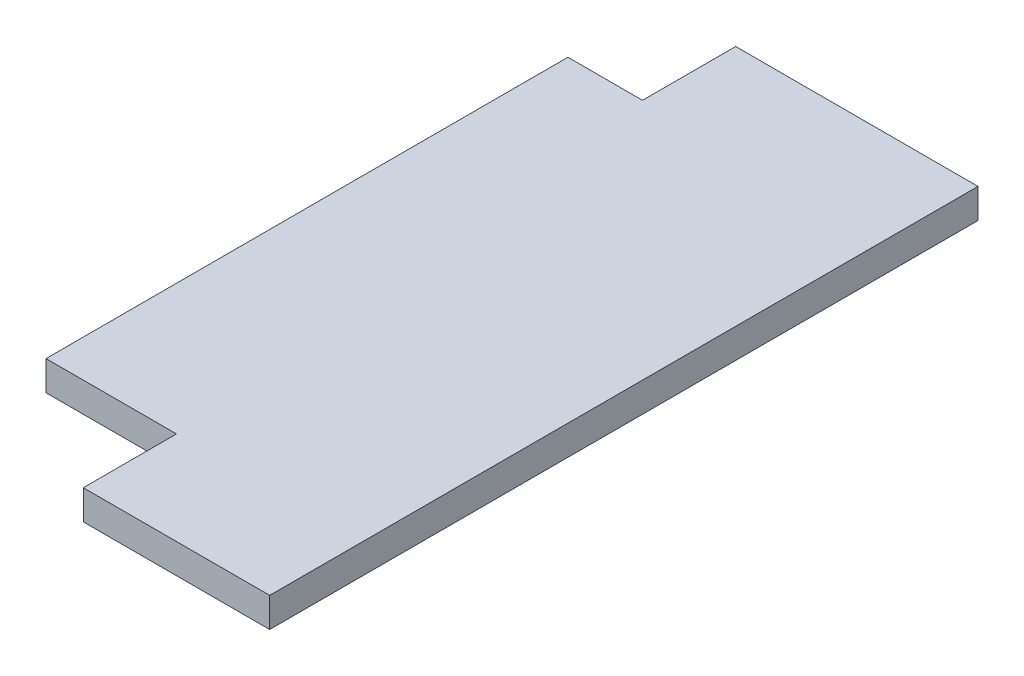
ISO-10303-21;
HEADER;
FILE_DESCRIPTION(('STEP AP214'),'2;1');
FILE_NAME('part.step','',(''),(''),'','','');
FILE_SCHEMA(('AUTOMOTIVE_DESIGN { 1 0 10303 214 1 1 1 1 }'));
ENDSEC;
DATA;
#1=APPLICATION_CONTEXT('core data for automotive mechanical design processes');
#2=APPLICATION_PROTOCOL_DEFINITION('international standard','automotive_design',2000,#1);
#3=PRODUCT_CONTEXT('',#1,'mechanical');
#4=PRODUCT('Part','Part','',(#3));
#5=PRODUCT_RELATED_PRODUCT_CATEGORY('part','',(#4));
#6=PRODUCT_DEFINITION_FORMATION('','',#4);
#7=PRODUCT_DEFINITION_CONTEXT('part definition',#1,'design');
#8=PRODUCT_DEFINITION('design','',#6,#7);
#9=PRODUCT_DEFINITION_SHAPE('','',#8);
#10=(LENGTH_UNIT() NAMED_UNIT(*) SI_UNIT(.MILLI.,.METRE.));
#11=(NAMED_UNIT(*) PLANE_ANGLE_UNIT() SI_UNIT($,.RADIAN.));
#12=(NAMED_UNIT(*) SI_UNIT($,.STERADIAN.) SOLID_ANGLE_UNIT());
#13=UNCERTAINTY_MEASURE_WITH_UNIT(LENGTH_MEASURE(1.E-05),#10,'distance_accuracy_value','');
#14=(GEOMETRIC_REPRESENTATION_CONTEXT(3) GLOBAL_UNCERTAINTY_ASSIGNED_CONTEXT((#13)) GLOBAL_UNIT_ASSIGNED_CONTEXT((#10,
#11,#12)) REPRESENTATION_CONTEXT('',''));
#15=CARTESIAN_POINT('',(0.,0.,0.));
#16=DIRECTION('',(0.,0.,1.));
#17=DIRECTION('',(1.,0.,0.));
#18=AXIS2_PLACEMENT_3D('',#15,#16,#17);
#19=CARTESIAN_POINT('',(-10.,1.5875,0.));
#20=DIRECTION('',(0.,0.,-1.));
#21=DIRECTION('',(-1.,0.,0.));
#22=AXIS2_PLACEMENT_3D('',#19,#20,#21);
#23=PLANE('',#22);
#24=DIRECTION('',(1.,0.,0.));
#25=VECTOR('',#24,1.);
#26=CARTESIAN_POINT('',(-10.,0.,0.));
#27=LINE('',#26,#25);
#28=CARTESIAN_POINT('',(-10.,0.,0.));
#29=VERTEX_POINT('',#28);
#30=CARTESIAN_POINT('',(0.,0.,0.));
#31=VERTEX_POINT('',#30);
#32=EDGE_CURVE('E129',#29,#31,#27,.T.);
#33=ORIENTED_EDGE('',*,*,#32,.T.);
#34=DIRECTION('',(0.,-1.,0.));
#35=VECTOR('',#34,1.);
#36=CARTESIAN_POINT('',(0.,1.5875,0.));
#37=LINE('',#36,#35);
#38=CARTESIAN_POINT('',(0.,1.5875,0.));
#39=VERTEX_POINT('',#38);
#40=EDGE_CURVE('E11',#39,#31,#37,.T.);
#41=ORIENTED_EDGE('',*,*,#40,.F.);
#42=DIRECTION('',(1.,0.,0.));
#43=VECTOR('',#42,1.);
#44=CARTESIAN_POINT('',(-10.,1.5875,0.));
#45=LINE('',#44,#43);
#46=CARTESIAN_POINT('',(-10.,1.5875,0.));
#47=VERTEX_POINT('',#46);
#48=EDGE_CURVE('E143',#47,#39,#45,.T.);
#49=ORIENTED_EDGE('',*,*,#48,.F.);
#50=DIRECTION('',(0.,-1.,0.));
#51=VECTOR('',#50,1.);
#52=CARTESIAN_POINT('',(-10.,1.5875,0.));
#53=LINE('',#52,#51);
#54=EDGE_CURVE('E125',#47,#29,#53,.T.);
#55=ORIENTED_EDGE('',*,*,#54,.T.);
#56=EDGE_LOOP('',(#33,#41,#49,#55));
#57=FACE_BOUND('',#56,.T.);
#58=ADVANCED_FACE('F33',(#57),#23,.F.);
#59=CARTESIAN_POINT('',(0.,1.5875,0.));
#60=DIRECTION('',(-1.,0.,0.));
#61=DIRECTION('',(0.,0.,1.));
#62=AXIS2_PLACEMENT_3D('',#59,#60,#61);
#63=PLANE('',#62);
#64=DIRECTION('',(0.,0.,-1.));
#65=VECTOR('',#64,1.);
#66=CARTESIAN_POINT('',(0.,0.,0.));
#67=LINE('',#66,#65);
#68=CARTESIAN_POINT('',(0.,0.,-38.));
#69=VERTEX_POINT('',#68);
#70=EDGE_CURVE('E132',#31,#69,#67,.T.);
#71=ORIENTED_EDGE('',*,*,#70,.T.);
#72=DIRECTION('',(0.,-1.,0.));
#73=VECTOR('',#72,1.);
#74=CARTESIAN_POINT('',(0.,1.5875,-38.));
#75=LINE('',#74,#73);
#76=CARTESIAN_POINT('',(0.,1.5875,-38.));
#77=VERTEX_POINT('',#76);
#78=EDGE_CURVE('E41',#77,#69,#75,.T.);
#79=ORIENTED_EDGE('',*,*,#78,.F.);
#80=DIRECTION('',(0.,0.,-1.));
#81=VECTOR('',#80,1.);
#82=CARTESIAN_POINT('',(0.,1.5875,0.));
#83=LINE('',#82,#81);
#84=EDGE_CURVE('E92',#39,#77,#83,.T.);
#85=ORIENTED_EDGE('',*,*,#84,.F.);
#86=ORIENTED_EDGE('',*,*,#40,.T.);
#87=EDGE_LOOP('',(#71,#79,#85,#86));
#88=FACE_BOUND('',#87,.T.);
#89=ADVANCED_FACE('F178',(#88),#63,.F.);
#90=CARTESIAN_POINT('',(0.,1.5875,-38.));
#91=DIRECTION('',(0.,0.,1.));
#92=DIRECTION('',(1.,0.,0.));
#93=AXIS2_PLACEMENT_3D('',#90,#91,#92);
#94=PLANE('',#93);
#95=DIRECTION('',(-1.,0.,0.));
#96=VECTOR('',#95,1.);
#97=CARTESIAN_POINT('',(0.,0.,-38.));
#98=LINE('',#97,#96);
#99=CARTESIAN_POINT('',(-13.,0.,-38.));
#100=VERTEX_POINT('',#99);
#101=EDGE_CURVE('E134',#69,#100,#98,.T.);
#102=ORIENTED_EDGE('',*,*,#101,.T.);
#103=DIRECTION('',(0.,-1.,0.));
#104=VECTOR('',#103,1.);
#105=CARTESIAN_POINT('',(-13.,1.5875,-38.));
#106=LINE('',#105,#104);
#107=CARTESIAN_POINT('',(-13.,1.5875,-38.));
#108=VERTEX_POINT('',#107);
#109=EDGE_CURVE('E150',#108,#100,#106,.T.);
#110=ORIENTED_EDGE('',*,*,#109,.F.);
#111=DIRECTION('',(-1.,0.,0.));
#112=VECTOR('',#111,1.);
#113=CARTESIAN_POINT('',(0.,1.5875,-38.));
#114=LINE('',#113,#112);
#115=EDGE_CURVE('E158',#77,#108,#114,.T.);
#116=ORIENTED_EDGE('',*,*,#115,.F.);
#117=ORIENTED_EDGE('',*,*,#78,.T.);
#118=EDGE_LOOP('',(#102,#110,#116,#117));
#119=FACE_BOUND('',#118,.T.);
#120=ADVANCED_FACE('F156',(#119),#94,.F.);
#121=CARTESIAN_POINT('',(-13.,1.5875,-38.));
#122=DIRECTION('',(1.,0.,0.));
#123=DIRECTION('',(0.,0.,-1.));
#124=AXIS2_PLACEMENT_3D('',#121,#122,#123);
#125=PLANE('',#124);
#126=DIRECTION('',(0.,0.,1.));
#127=VECTOR('',#126,1.);
#128=CARTESIAN_POINT('',(-13.,0.,-38.));
#129=LINE('',#128,#127);
#130=CARTESIAN_POINT('',(-13.,0.,-33.));
#131=VERTEX_POINT('',#130);
#132=EDGE_CURVE('E136',#100,#131,#129,.T.);
#133=ORIENTED_EDGE('',*,*,#132,.T.);
#134=DIRECTION('',(0.,-1.,0.));
#135=VECTOR('',#134,1.);
#136=CARTESIAN_POINT('',(-13.,1.5875,-33.));
#137=LINE('',#136,#135);
#138=CARTESIAN_POINT('',(-13.,1.5875,-33.));
#139=VERTEX_POINT('',#138);
#140=EDGE_CURVE('E147',#139,#131,#137,.T.);
#141=ORIENTED_EDGE('',*,*,#140,.F.);
#142=DIRECTION('',(0.,0.,1.));
#143=VECTOR('',#142,1.);
#144=CARTESIAN_POINT('',(-13.,1.5875,-38.));
#145=LINE('',#144,#143);
#146=EDGE_CURVE('E170',#108,#139,#145,.T.);
#147=ORIENTED_EDGE('',*,*,#146,.F.);
#148=ORIENTED_EDGE('',*,*,#109,.T.);
#149=EDGE_LOOP('',(#133,#141,#147,#148));
#150=FACE_BOUND('',#149,.T.);
#151=ADVANCED_FACE('F166',(#150),#125,.F.);
#152=CARTESIAN_POINT('',(-13.,1.5875,-33.));
#153=DIRECTION('',(0.,0.,1.));
#154=DIRECTION('',(1.,0.,0.));
#155=AXIS2_PLACEMENT_3D('',#152,#153,#154);
#156=PLANE('',#155);
#157=DIRECTION('',(-1.,0.,0.));
#158=VECTOR('',#157,1.);
#159=CARTESIAN_POINT('',(-13.,0.,-33.));
#160=LINE('',#159,#158);
#161=CARTESIAN_POINT('',(-17.,0.,-33.));
#162=VERTEX_POINT('',#161);
#163=EDGE_CURVE('E138',#131,#162,#160,.T.);
#164=ORIENTED_EDGE('',*,*,#163,.T.);
#165=DIRECTION('',(0.,-1.,0.));
#166=VECTOR('',#165,1.);
#167=CARTESIAN_POINT('',(-17.,1.5875,-33.));
#168=LINE('',#167,#166);
#169=CARTESIAN_POINT('',(-17.,1.5875,-33.));
#170=VERTEX_POINT('',#169);
#171=EDGE_CURVE('E120',#170,#162,#168,.T.);
#172=ORIENTED_EDGE('',*,*,#171,.F.);
#173=DIRECTION('',(-1.,0.,0.));
#174=VECTOR('',#173,1.);
#175=CARTESIAN_POINT('',(-13.,1.5875,-33.));
#176=LINE('',#175,#174);
#177=EDGE_CURVE('E111',#139,#170,#176,.T.);
#178=ORIENTED_EDGE('',*,*,#177,.F.);
#179=ORIENTED_EDGE('',*,*,#140,.T.);
#180=EDGE_LOOP('',(#164,#172,#178,#179));
#181=FACE_BOUND('',#180,.T.);
#182=ADVANCED_FACE('F169',(#181),#156,.F.);
#183=CARTESIAN_POINT('',(-17.,1.5875,-33.));
#184=DIRECTION('',(1.,0.,0.));
#185=DIRECTION('',(0.,0.,-1.));
#186=AXIS2_PLACEMENT_3D('',#183,#184,#185);
#187=PLANE('',#186);
#188=DIRECTION('',(0.,0.,1.));
#189=VECTOR('',#188,1.);
#190=CARTESIAN_POINT('',(-17.,0.,-33.));
#191=LINE('',#190,#189);
#192=CARTESIAN_POINT('',(-17.,0.,-5.));
#193=VERTEX_POINT('',#192);
#194=EDGE_CURVE('E119',#162,#193,#191,.T.);
#195=ORIENTED_EDGE('',*,*,#194,.T.);
#196=DIRECTION('',(0.,-1.,0.));
#197=VECTOR('',#196,1.);
#198=CARTESIAN_POINT('',(-17.,1.5875,-5.));
#199=LINE('',#198,#197);
#200=CARTESIAN_POINT('',(-17.,1.5875,-5.));
#201=VERTEX_POINT('',#200);
#202=EDGE_CURVE('E116',#201,#193,#199,.T.);
#203=ORIENTED_EDGE('',*,*,#202,.F.);
#204=DIRECTION('',(0.,0.,1.));
#205=VECTOR('',#204,1.);
#206=CARTESIAN_POINT('',(-17.,1.5875,-33.));
#207=LINE('',#206,#205);
#208=EDGE_CURVE('E105',#170,#201,#207,.T.);
#209=ORIENTED_EDGE('',*,*,#208,.F.);
#210=ORIENTED_EDGE('',*,*,#171,.T.);
#211=EDGE_LOOP('',(#195,#203,#209,#210));
#212=FACE_BOUND('',#211,.T.);
#213=ADVANCED_FACE('F117',(#212),#187,.F.);
#214=CARTESIAN_POINT('',(-17.,1.5875,-5.));
#215=DIRECTION('',(0.,0.,-1.));
#216=DIRECTION('',(-1.,0.,0.));
#217=AXIS2_PLACEMENT_3D('',#214,#215,#216);
#218=PLANE('',#217);
#219=DIRECTION('',(1.,0.,0.));
#220=VECTOR('',#219,1.);
#221=CARTESIAN_POINT('',(-17.,0.,-5.));
#222=LINE('',#221,#220);
#223=CARTESIAN_POINT('',(-10.,0.,-5.));
#224=VERTEX_POINT('',#223);
#225=EDGE_CURVE('E78',#193,#224,#222,.T.);
#226=ORIENTED_EDGE('',*,*,#225,.T.);
#227=DIRECTION('',(0.,-1.,0.));
#228=VECTOR('',#227,1.);
#229=CARTESIAN_POINT('',(-10.,1.5875,-5.));
#230=LINE('',#229,#228);
#231=CARTESIAN_POINT('',(-10.,1.5875,-5.));
#232=VERTEX_POINT('',#231);
#233=EDGE_CURVE('E121',#232,#224,#230,.T.);
#234=ORIENTED_EDGE('',*,*,#233,.F.);
#235=DIRECTION('',(1.,0.,0.));
#236=VECTOR('',#235,1.);
#237=CARTESIAN_POINT('',(-17.,1.5875,-5.));
#238=LINE('',#237,#236);
#239=EDGE_CURVE('E109',#201,#232,#238,.T.);
#240=ORIENTED_EDGE('',*,*,#239,.F.);
#241=ORIENTED_EDGE('',*,*,#202,.T.);
#242=EDGE_LOOP('',(#226,#234,#240,#241));
#243=FACE_BOUND('',#242,.T.);
#244=ADVANCED_FACE('F123',(#243),#218,.F.);
#245=CARTESIAN_POINT('',(-10.,1.5875,-5.));
#246=DIRECTION('',(1.,0.,0.));
#247=DIRECTION('',(0.,0.,-1.));
#248=AXIS2_PLACEMENT_3D('',#245,#246,#247);
#249=PLANE('',#248);
#250=DIRECTION('',(0.,0.,1.));
#251=VECTOR('',#250,1.);
#252=CARTESIAN_POINT('',(-10.,0.,-5.));
#253=LINE('',#252,#251);
#254=EDGE_CURVE('E84',#224,#29,#253,.T.);
#255=ORIENTED_EDGE('',*,*,#254,.T.);
#256=ORIENTED_EDGE('',*,*,#54,.F.);
#257=DIRECTION('',(0.,0.,1.));
#258=VECTOR('',#257,1.);
#259=CARTESIAN_POINT('',(-10.,1.5875,-5.));
#260=LINE('',#259,#258);
#261=EDGE_CURVE('E49',#232,#47,#260,.T.);
#262=ORIENTED_EDGE('',*,*,#261,.F.);
#263=ORIENTED_EDGE('',*,*,#233,.T.);
#264=EDGE_LOOP('',(#255,#256,#262,#263));
#265=FACE_BOUND('',#264,.T.);
#266=ADVANCED_FACE('F194',(#265),#249,.F.);
#267=CARTESIAN_POINT('',(0.,1.5875,0.));
#268=DIRECTION('',(0.,1.,0.));
#269=DIRECTION('',(0.,0.,1.));
#270=AXIS2_PLACEMENT_3D('',#267,#268,#269);
#271=PLANE('',#270);
#272=ORIENTED_EDGE('',*,*,#48,.T.);
#273=ORIENTED_EDGE('',*,*,#84,.T.);
#274=ORIENTED_EDGE('',*,*,#115,.T.);
#275=ORIENTED_EDGE('',*,*,#146,.T.);
#276=ORIENTED_EDGE('',*,*,#177,.T.);
#277=ORIENTED_EDGE('',*,*,#208,.T.);
#278=ORIENTED_EDGE('',*,*,#239,.T.);
#279=ORIENTED_EDGE('',*,*,#261,.T.);
#280=EDGE_LOOP('',(#272,#273,#274,#275,#276,#277,#278,#279));
#281=FACE_BOUND('',#280,.T.);
#282=ADVANCED_FACE('F107',(#281),#271,.T.);
#283=CARTESIAN_POINT('',(0.,0.,0.));
#284=DIRECTION('',(0.,1.,0.));
#285=DIRECTION('',(0.,0.,1.));
#286=AXIS2_PLACEMENT_3D('',#283,#284,#285);
#287=PLANE('',#286);
#288=ORIENTED_EDGE('',*,*,#32,.F.);
#289=ORIENTED_EDGE('',*,*,#254,.F.);
#290=ORIENTED_EDGE('',*,*,#225,.F.);
#291=ORIENTED_EDGE('',*,*,#194,.F.);
#292=ORIENTED_EDGE('',*,*,#163,.F.);
#293=ORIENTED_EDGE('',*,*,#132,.F.);
#294=ORIENTED_EDGE('',*,*,#101,.F.);
#295=ORIENTED_EDGE('',*,*,#70,.F.);
#296=EDGE_LOOP('',(#288,#289,#290,#291,#292,#293,#294,#295));
#297=FACE_BOUND('',#296,.T.);
#298=ADVANCED_FACE('F162',(#297),#287,.F.);
#299=CLOSED_SHELL('',(#58,#89,#120,#151,#182,#213,#244,#266,#282,#298));
#300=MANIFOLD_SOLID_BREP('B2',#299);
#301=ADVANCED_BREP_SHAPE_REPRESENTATION('',(#18,#300),#14);
#302=SHAPE_DEFINITION_REPRESENTATION(#9,#301);
ENDSEC;
END-ISO-10303-21;
